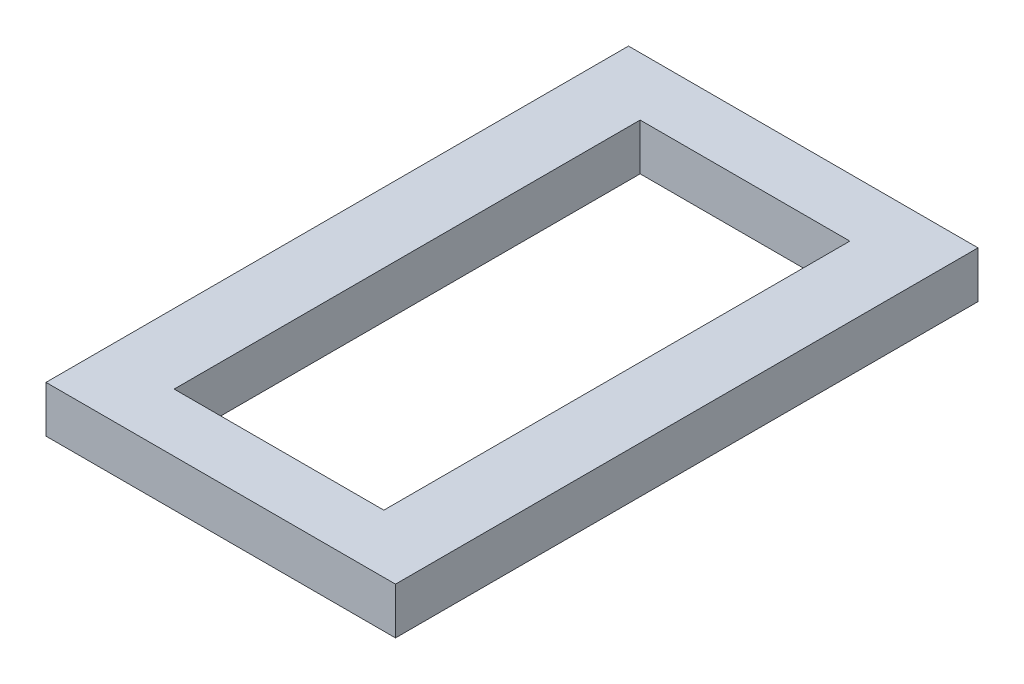
ISO-10303-21;
HEADER;
FILE_DESCRIPTION(('STEP AP214'),'2;1');
FILE_NAME('part.step','',(''),(''),'','','');
FILE_SCHEMA(('AUTOMOTIVE_DESIGN { 1 0 10303 214 1 1 1 1 }'));
ENDSEC;
DATA;
#1=APPLICATION_CONTEXT('core data for automotive mechanical design processes');
#2=APPLICATION_PROTOCOL_DEFINITION('international standard','automotive_design',2000,#1);
#3=PRODUCT_CONTEXT('',#1,'mechanical');
#4=PRODUCT('Part','Part','',(#3));
#5=PRODUCT_RELATED_PRODUCT_CATEGORY('part','',(#4));
#6=PRODUCT_DEFINITION_FORMATION('','',#4);
#7=PRODUCT_DEFINITION_CONTEXT('part definition',#1,'design');
#8=PRODUCT_DEFINITION('design','',#6,#7);
#9=PRODUCT_DEFINITION_SHAPE('','',#8);
#10=(LENGTH_UNIT() NAMED_UNIT(*) SI_UNIT(.MILLI.,.METRE.));
#11=(NAMED_UNIT(*) PLANE_ANGLE_UNIT() SI_UNIT($,.RADIAN.));
#12=(NAMED_UNIT(*) SI_UNIT($,.STERADIAN.) SOLID_ANGLE_UNIT());
#13=UNCERTAINTY_MEASURE_WITH_UNIT(LENGTH_MEASURE(1.E-05),#10,'distance_accuracy_value','');
#14=(GEOMETRIC_REPRESENTATION_CONTEXT(3) GLOBAL_UNCERTAINTY_ASSIGNED_CONTEXT((#13)) GLOBAL_UNIT_ASSIGNED_CONTEXT((#10,
#11,#12)) REPRESENTATION_CONTEXT('',''));
#15=CARTESIAN_POINT('',(0.,0.,0.));
#16=DIRECTION('',(0.,0.,1.));
#17=DIRECTION('',(1.,0.,0.));
#18=AXIS2_PLACEMENT_3D('',#15,#16,#17);
#19=CARTESIAN_POINT('',(0.,6.,0.));
#20=DIRECTION('',(0.,1.,0.));
#21=DIRECTION('',(0.,0.,1.));
#22=AXIS2_PLACEMENT_3D('',#19,#20,#21);
#23=PLANE('',#22);
#24=DIRECTION('',(0.,0.,-1.));
#25=VECTOR('',#24,1.);
#26=CARTESIAN_POINT('',(22.5,6.,-37.5));
#27=LINE('',#26,#25);
#28=CARTESIAN_POINT('',(22.5,6.,37.5));
#29=VERTEX_POINT('',#28);
#30=CARTESIAN_POINT('',(22.5,6.,-37.5));
#31=VERTEX_POINT('',#30);
#32=EDGE_CURVE('E153',#29,#31,#27,.T.);
#33=ORIENTED_EDGE('',*,*,#32,.T.);
#34=DIRECTION('',(-1.,0.,0.));
#35=VECTOR('',#34,1.);
#36=CARTESIAN_POINT('',(-22.5,6.,-37.5));
#37=LINE('',#36,#35);
#38=CARTESIAN_POINT('',(-22.5,6.,-37.5));
#39=VERTEX_POINT('',#38);
#40=EDGE_CURVE('E157',#31,#39,#37,.T.);
#41=ORIENTED_EDGE('',*,*,#40,.T.);
#42=DIRECTION('',(0.,0.,1.));
#43=VECTOR('',#42,1.);
#44=CARTESIAN_POINT('',(-22.5,6.,-37.5));
#45=LINE('',#44,#43);
#46=CARTESIAN_POINT('',(-22.5,6.,37.5));
#47=VERTEX_POINT('',#46);
#48=EDGE_CURVE('E161',#39,#47,#45,.T.);
#49=ORIENTED_EDGE('',*,*,#48,.T.);
#50=DIRECTION('',(1.,0.,0.));
#51=VECTOR('',#50,1.);
#52=CARTESIAN_POINT('',(-22.5,6.,37.5));
#53=LINE('',#52,#51);
#54=EDGE_CURVE('E164',#47,#29,#53,.T.);
#55=ORIENTED_EDGE('',*,*,#54,.T.);
#56=EDGE_LOOP('',(#33,#41,#49,#55));
#57=FACE_BOUND('',#56,.T.);
#58=DIRECTION('',(-1.,0.,0.));
#59=VECTOR('',#58,1.);
#60=CARTESIAN_POINT('',(-13.5,6.,-30.));
#61=LINE('',#60,#59);
#62=CARTESIAN_POINT('',(13.5,6.,-30.));
#63=VERTEX_POINT('',#62);
#64=CARTESIAN_POINT('',(-13.5,6.,-30.));
#65=VERTEX_POINT('',#64);
#66=EDGE_CURVE('E114',#63,#65,#61,.T.);
#67=ORIENTED_EDGE('',*,*,#66,.F.);
#68=DIRECTION('',(0.,0.,-1.));
#69=VECTOR('',#68,1.);
#70=CARTESIAN_POINT('',(13.5,6.,-30.));
#71=LINE('',#70,#69);
#72=CARTESIAN_POINT('',(13.5,6.,30.));
#73=VERTEX_POINT('',#72);
#74=EDGE_CURVE('E105',#73,#63,#71,.T.);
#75=ORIENTED_EDGE('',*,*,#74,.F.);
#76=DIRECTION('',(1.,0.,0.));
#77=VECTOR('',#76,1.);
#78=CARTESIAN_POINT('',(-13.5,6.,30.));
#79=LINE('',#78,#77);
#80=CARTESIAN_POINT('',(-13.5,6.,30.));
#81=VERTEX_POINT('',#80);
#82=EDGE_CURVE('E131',#81,#73,#79,.T.);
#83=ORIENTED_EDGE('',*,*,#82,.F.);
#84=DIRECTION('',(0.,0.,1.));
#85=VECTOR('',#84,1.);
#86=CARTESIAN_POINT('',(-13.5,6.,-30.));
#87=LINE('',#86,#85);
#88=EDGE_CURVE('E127',#65,#81,#87,.T.);
#89=ORIENTED_EDGE('',*,*,#88,.F.);
#90=EDGE_LOOP('',(#67,#75,#83,#89));
#91=FACE_BOUND('',#90,.T.);
#92=ADVANCED_FACE('F39',(#57,#91),#23,.T.);
#93=CARTESIAN_POINT('',(0.,0.,0.));
#94=DIRECTION('',(0.,1.,0.));
#95=DIRECTION('',(0.,0.,1.));
#96=AXIS2_PLACEMENT_3D('',#93,#94,#95);
#97=PLANE('',#96);
#98=DIRECTION('',(0.,0.,-1.));
#99=VECTOR('',#98,1.);
#100=CARTESIAN_POINT('',(22.5,0.,-37.5));
#101=LINE('',#100,#99);
#102=CARTESIAN_POINT('',(22.5,0.,37.5));
#103=VERTEX_POINT('',#102);
#104=CARTESIAN_POINT('',(22.5,0.,-37.5));
#105=VERTEX_POINT('',#104);
#106=EDGE_CURVE('E123',#103,#105,#101,.T.);
#107=ORIENTED_EDGE('',*,*,#106,.F.);
#108=DIRECTION('',(1.,0.,0.));
#109=VECTOR('',#108,1.);
#110=CARTESIAN_POINT('',(-22.5,0.,37.5));
#111=LINE('',#110,#109);
#112=CARTESIAN_POINT('',(-22.5,0.,37.5));
#113=VERTEX_POINT('',#112);
#114=EDGE_CURVE('E158',#113,#103,#111,.T.);
#115=ORIENTED_EDGE('',*,*,#114,.F.);
#116=DIRECTION('',(0.,0.,1.));
#117=VECTOR('',#116,1.);
#118=CARTESIAN_POINT('',(-22.5,0.,-37.5));
#119=LINE('',#118,#117);
#120=CARTESIAN_POINT('',(-22.5,0.,-37.5));
#121=VERTEX_POINT('',#120);
#122=EDGE_CURVE('E174',#121,#113,#119,.T.);
#123=ORIENTED_EDGE('',*,*,#122,.F.);
#124=DIRECTION('',(-1.,0.,0.));
#125=VECTOR('',#124,1.);
#126=CARTESIAN_POINT('',(-22.5,0.,-37.5));
#127=LINE('',#126,#125);
#128=EDGE_CURVE('E171',#105,#121,#127,.T.);
#129=ORIENTED_EDGE('',*,*,#128,.F.);
#130=EDGE_LOOP('',(#107,#115,#123,#129));
#131=FACE_BOUND('',#130,.T.);
#132=DIRECTION('',(0.,0.,-1.));
#133=VECTOR('',#132,1.);
#134=CARTESIAN_POINT('',(13.5,0.,-30.));
#135=LINE('',#134,#133);
#136=CARTESIAN_POINT('',(13.5,0.,30.));
#137=VERTEX_POINT('',#136);
#138=CARTESIAN_POINT('',(13.5,0.,-30.));
#139=VERTEX_POINT('',#138);
#140=EDGE_CURVE('E63',#137,#139,#135,.T.);
#141=ORIENTED_EDGE('',*,*,#140,.T.);
#142=DIRECTION('',(-1.,0.,0.));
#143=VECTOR('',#142,1.);
#144=CARTESIAN_POINT('',(-13.5,0.,-30.));
#145=LINE('',#144,#143);
#146=CARTESIAN_POINT('',(-13.5,0.,-30.));
#147=VERTEX_POINT('',#146);
#148=EDGE_CURVE('E121',#139,#147,#145,.T.);
#149=ORIENTED_EDGE('',*,*,#148,.T.);
#150=DIRECTION('',(0.,0.,1.));
#151=VECTOR('',#150,1.);
#152=CARTESIAN_POINT('',(-13.5,0.,-30.));
#153=LINE('',#152,#151);
#154=CARTESIAN_POINT('',(-13.5,0.,30.));
#155=VERTEX_POINT('',#154);
#156=EDGE_CURVE('E140',#147,#155,#153,.T.);
#157=ORIENTED_EDGE('',*,*,#156,.T.);
#158=DIRECTION('',(1.,0.,0.));
#159=VECTOR('',#158,1.);
#160=CARTESIAN_POINT('',(-13.5,0.,30.));
#161=LINE('',#160,#159);
#162=EDGE_CURVE('E115',#155,#137,#161,.T.);
#163=ORIENTED_EDGE('',*,*,#162,.T.);
#164=EDGE_LOOP('',(#141,#149,#157,#163));
#165=FACE_BOUND('',#164,.T.);
#166=ADVANCED_FACE('F197',(#131,#165),#97,.F.);
#167=CARTESIAN_POINT('',(22.5,6.,-37.5));
#168=DIRECTION('',(-1.,0.,0.));
#169=DIRECTION('',(0.,0.,1.));
#170=AXIS2_PLACEMENT_3D('',#167,#168,#169);
#171=PLANE('',#170);
#172=ORIENTED_EDGE('',*,*,#106,.T.);
#173=DIRECTION('',(0.,-1.,0.));
#174=VECTOR('',#173,1.);
#175=CARTESIAN_POINT('',(22.5,6.,-37.5));
#176=LINE('',#175,#174);
#177=EDGE_CURVE('E11',#31,#105,#176,.T.);
#178=ORIENTED_EDGE('',*,*,#177,.F.);
#179=ORIENTED_EDGE('',*,*,#32,.F.);
#180=DIRECTION('',(0.,-1.,0.));
#181=VECTOR('',#180,1.);
#182=CARTESIAN_POINT('',(22.5,6.,37.5));
#183=LINE('',#182,#181);
#184=EDGE_CURVE('E167',#29,#103,#183,.T.);
#185=ORIENTED_EDGE('',*,*,#184,.T.);
#186=EDGE_LOOP('',(#172,#178,#179,#185));
#187=FACE_BOUND('',#186,.T.);
#188=ADVANCED_FACE('F41',(#187),#171,.F.);
#189=CARTESIAN_POINT('',(-22.5,6.,-37.5));
#190=DIRECTION('',(0.,0.,1.));
#191=DIRECTION('',(1.,0.,0.));
#192=AXIS2_PLACEMENT_3D('',#189,#190,#191);
#193=PLANE('',#192);
#194=ORIENTED_EDGE('',*,*,#128,.T.);
#195=DIRECTION('',(0.,-1.,0.));
#196=VECTOR('',#195,1.);
#197=CARTESIAN_POINT('',(-22.5,6.,-37.5));
#198=LINE('',#197,#196);
#199=EDGE_CURVE('E48',#39,#121,#198,.T.);
#200=ORIENTED_EDGE('',*,*,#199,.F.);
#201=ORIENTED_EDGE('',*,*,#40,.F.);
#202=ORIENTED_EDGE('',*,*,#177,.T.);
#203=EDGE_LOOP('',(#194,#200,#201,#202));
#204=FACE_BOUND('',#203,.T.);
#205=ADVANCED_FACE('F207',(#204),#193,.F.);
#206=CARTESIAN_POINT('',(-22.5,6.,-37.5));
#207=DIRECTION('',(1.,0.,0.));
#208=DIRECTION('',(0.,0.,-1.));
#209=AXIS2_PLACEMENT_3D('',#206,#207,#208);
#210=PLANE('',#209);
#211=ORIENTED_EDGE('',*,*,#122,.T.);
#212=DIRECTION('',(0.,-1.,0.));
#213=VECTOR('',#212,1.);
#214=CARTESIAN_POINT('',(-22.5,6.,37.5));
#215=LINE('',#214,#213);
#216=EDGE_CURVE('E182',#47,#113,#215,.T.);
#217=ORIENTED_EDGE('',*,*,#216,.F.);
#218=ORIENTED_EDGE('',*,*,#48,.F.);
#219=ORIENTED_EDGE('',*,*,#199,.T.);
#220=EDGE_LOOP('',(#211,#217,#218,#219));
#221=FACE_BOUND('',#220,.T.);
#222=ADVANCED_FACE('F191',(#221),#210,.F.);
#223=CARTESIAN_POINT('',(-22.5,6.,37.5));
#224=DIRECTION('',(0.,0.,-1.));
#225=DIRECTION('',(-1.,0.,0.));
#226=AXIS2_PLACEMENT_3D('',#223,#224,#225);
#227=PLANE('',#226);
#228=ORIENTED_EDGE('',*,*,#114,.T.);
#229=ORIENTED_EDGE('',*,*,#184,.F.);
#230=ORIENTED_EDGE('',*,*,#54,.F.);
#231=ORIENTED_EDGE('',*,*,#216,.T.);
#232=EDGE_LOOP('',(#228,#229,#230,#231));
#233=FACE_BOUND('',#232,.T.);
#234=ADVANCED_FACE('F201',(#233),#227,.F.);
#235=CARTESIAN_POINT('',(13.5,6.,-30.));
#236=DIRECTION('',(-1.,0.,0.));
#237=DIRECTION('',(0.,0.,1.));
#238=AXIS2_PLACEMENT_3D('',#235,#236,#237);
#239=PLANE('',#238);
#240=ORIENTED_EDGE('',*,*,#140,.F.);
#241=DIRECTION('',(0.,-1.,0.));
#242=VECTOR('',#241,1.);
#243=CARTESIAN_POINT('',(13.5,6.,30.));
#244=LINE('',#243,#242);
#245=EDGE_CURVE('E109',#73,#137,#244,.T.);
#246=ORIENTED_EDGE('',*,*,#245,.F.);
#247=ORIENTED_EDGE('',*,*,#74,.T.);
#248=DIRECTION('',(0.,-1.,0.));
#249=VECTOR('',#248,1.);
#250=CARTESIAN_POINT('',(13.5,6.,-30.));
#251=LINE('',#250,#249);
#252=EDGE_CURVE('E108',#63,#139,#251,.T.);
#253=ORIENTED_EDGE('',*,*,#252,.T.);
#254=EDGE_LOOP('',(#240,#246,#247,#253));
#255=FACE_BOUND('',#254,.T.);
#256=ADVANCED_FACE('F107',(#255),#239,.T.);
#257=CARTESIAN_POINT('',(-13.5,6.,-30.));
#258=DIRECTION('',(0.,0.,1.));
#259=DIRECTION('',(1.,0.,0.));
#260=AXIS2_PLACEMENT_3D('',#257,#258,#259);
#261=PLANE('',#260);
#262=ORIENTED_EDGE('',*,*,#148,.F.);
#263=ORIENTED_EDGE('',*,*,#252,.F.);
#264=ORIENTED_EDGE('',*,*,#66,.T.);
#265=DIRECTION('',(0.,-1.,0.));
#266=VECTOR('',#265,1.);
#267=CARTESIAN_POINT('',(-13.5,6.,-30.));
#268=LINE('',#267,#266);
#269=EDGE_CURVE('E124',#65,#147,#268,.T.);
#270=ORIENTED_EDGE('',*,*,#269,.T.);
#271=EDGE_LOOP('',(#262,#263,#264,#270));
#272=FACE_BOUND('',#271,.T.);
#273=ADVANCED_FACE('F118',(#272),#261,.T.);
#274=CARTESIAN_POINT('',(-13.5,6.,-30.));
#275=DIRECTION('',(1.,0.,0.));
#276=DIRECTION('',(0.,0.,-1.));
#277=AXIS2_PLACEMENT_3D('',#274,#275,#276);
#278=PLANE('',#277);
#279=ORIENTED_EDGE('',*,*,#156,.F.);
#280=ORIENTED_EDGE('',*,*,#269,.F.);
#281=ORIENTED_EDGE('',*,*,#88,.T.);
#282=DIRECTION('',(0.,-1.,0.));
#283=VECTOR('',#282,1.);
#284=CARTESIAN_POINT('',(-13.5,6.,30.));
#285=LINE('',#284,#283);
#286=EDGE_CURVE('E55',#81,#155,#285,.T.);
#287=ORIENTED_EDGE('',*,*,#286,.T.);
#288=EDGE_LOOP('',(#279,#280,#281,#287));
#289=FACE_BOUND('',#288,.T.);
#290=ADVANCED_FACE('F230',(#289),#278,.T.);
#291=CARTESIAN_POINT('',(-13.5,6.,30.));
#292=DIRECTION('',(0.,0.,-1.));
#293=DIRECTION('',(-1.,0.,0.));
#294=AXIS2_PLACEMENT_3D('',#291,#292,#293);
#295=PLANE('',#294);
#296=ORIENTED_EDGE('',*,*,#162,.F.);
#297=ORIENTED_EDGE('',*,*,#286,.F.);
#298=ORIENTED_EDGE('',*,*,#82,.T.);
#299=ORIENTED_EDGE('',*,*,#245,.T.);
#300=EDGE_LOOP('',(#296,#297,#298,#299));
#301=FACE_BOUND('',#300,.T.);
#302=ADVANCED_FACE('F234',(#301),#295,.T.);
#303=CLOSED_SHELL('',(#92,#166,#188,#205,#222,#234,#256,#273,#290,#302));
#304=MANIFOLD_SOLID_BREP('B2',#303);
#305=ADVANCED_BREP_SHAPE_REPRESENTATION('',(#18,#304),#14);
#306=SHAPE_DEFINITION_REPRESENTATION(#9,#305);
ENDSEC;
END-ISO-10303-21;
